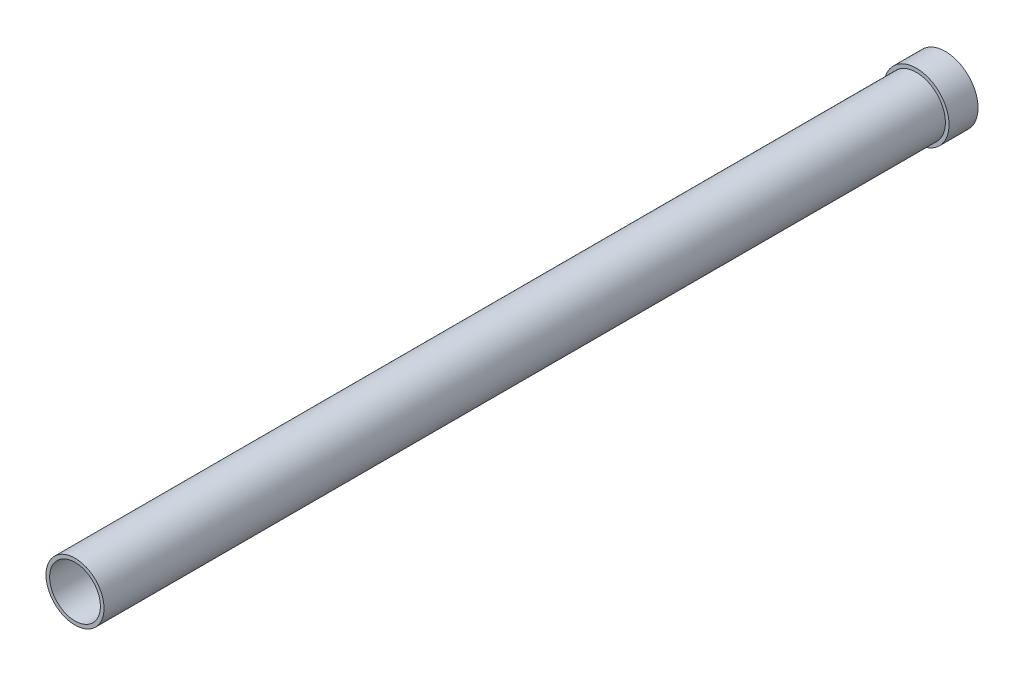
ISO-10303-21;
HEADER;
FILE_DESCRIPTION(('STEP AP214'),'2;1');
FILE_NAME('part.step','',(''),(''),'','','');
FILE_SCHEMA(('AUTOMOTIVE_DESIGN { 1 0 10303 214 1 1 1 1 }'));
ENDSEC;
DATA;
#1=APPLICATION_CONTEXT('core data for automotive mechanical design processes');
#2=APPLICATION_PROTOCOL_DEFINITION('international standard','automotive_design',2000,#1);
#3=PRODUCT_CONTEXT('',#1,'mechanical');
#4=PRODUCT('Part','Part','',(#3));
#5=PRODUCT_RELATED_PRODUCT_CATEGORY('part','',(#4));
#6=PRODUCT_DEFINITION_FORMATION('','',#4);
#7=PRODUCT_DEFINITION_CONTEXT('part definition',#1,'design');
#8=PRODUCT_DEFINITION('design','',#6,#7);
#9=PRODUCT_DEFINITION_SHAPE('','',#8);
#10=(LENGTH_UNIT() NAMED_UNIT(*) SI_UNIT(.MILLI.,.METRE.));
#11=(NAMED_UNIT(*) PLANE_ANGLE_UNIT() SI_UNIT($,.RADIAN.));
#12=(NAMED_UNIT(*) SI_UNIT($,.STERADIAN.) SOLID_ANGLE_UNIT());
#13=UNCERTAINTY_MEASURE_WITH_UNIT(LENGTH_MEASURE(1.E-05),#10,'distance_accuracy_value','');
#14=(GEOMETRIC_REPRESENTATION_CONTEXT(3) GLOBAL_UNCERTAINTY_ASSIGNED_CONTEXT((#13)) GLOBAL_UNIT_ASSIGNED_CONTEXT((#10,
#11,#12)) REPRESENTATION_CONTEXT('',''));
#15=CARTESIAN_POINT('',(0.,0.,0.));
#16=DIRECTION('',(0.,0.,1.));
#17=DIRECTION('',(1.,0.,0.));
#18=AXIS2_PLACEMENT_3D('',#15,#16,#17);
#19=CARTESIAN_POINT('',(0.,0.,76.2));
#20=DIRECTION('',(0.,0.,-1.));
#21=DIRECTION('',(-1.,0.,0.));
#22=AXIS2_PLACEMENT_3D('',#19,#20,#21);
#23=CYLINDRICAL_SURFACE('',#22,2.54);
#24=CARTESIAN_POINT('',(0.,0.,76.2));
#25=DIRECTION('',(0.,0.,1.));
#26=DIRECTION('',(1.,0.,0.));
#27=AXIS2_PLACEMENT_3D('',#24,#25,#26);
#28=CIRCLE('',#27,2.54);
#29=CARTESIAN_POINT('',(-2.54,0.,76.2));
#30=VERTEX_POINT('',#29);
#31=EDGE_CURVE('E39',#30,#30,#28,.T.);
#32=CARTESIAN_POINT('',(0.,0.,2.54));
#33=DIRECTION('',(0.,0.,-1.));
#34=DIRECTION('',(-1.,0.,0.));
#35=AXIS2_PLACEMENT_3D('',#32,#33,#34);
#36=CIRCLE('',#35,2.54);
#37=CARTESIAN_POINT('',(-2.54,0.,2.54000000000001));
#38=VERTEX_POINT('',#37);
#39=EDGE_CURVE('E10',#38,#38,#36,.T.);
#40=CARTESIAN_POINT('',(-2.54,0.,76.2));
#41=CARTESIAN_POINT('',(-2.54,0.,75.4327083333333));
#42=CARTESIAN_POINT('',(-2.54,0.,74.6654166666667));
#43=CARTESIAN_POINT('',(-2.54,0.,73.1308333333333));
#44=CARTESIAN_POINT('',(-2.54,0.,72.3635416666667));
#45=CARTESIAN_POINT('',(-2.54,0.,70.8289583333333));
#46=CARTESIAN_POINT('',(-2.54,0.,70.0616666666667));
#47=CARTESIAN_POINT('',(-2.54,0.,68.5270833333333));
#48=CARTESIAN_POINT('',(-2.54,0.,67.7597916666667));
#49=CARTESIAN_POINT('',(-2.54,0.,66.2252083333333));
#50=CARTESIAN_POINT('',(-2.54,0.,65.4579166666667));
#51=CARTESIAN_POINT('',(-2.54,0.,63.9233333333333));
#52=CARTESIAN_POINT('',(-2.54,0.,63.1560416666667));
#53=CARTESIAN_POINT('',(-2.54,0.,61.6214583333333));
#54=CARTESIAN_POINT('',(-2.54,0.,60.8541666666667));
#55=CARTESIAN_POINT('',(-2.54,0.,59.3195833333333));
#56=CARTESIAN_POINT('',(-2.54,0.,58.5522916666667));
#57=CARTESIAN_POINT('',(-2.54,0.,57.0177083333333));
#58=CARTESIAN_POINT('',(-2.54,0.,56.2504166666667));
#59=CARTESIAN_POINT('',(-2.54,0.,54.7158333333333));
#60=CARTESIAN_POINT('',(-2.54,0.,53.9485416666667));
#61=CARTESIAN_POINT('',(-2.54,0.,52.4139583333333));
#62=CARTESIAN_POINT('',(-2.54,0.,51.6466666666667));
#63=CARTESIAN_POINT('',(-2.54,0.,50.1120833333333));
#64=CARTESIAN_POINT('',(-2.54,0.,49.3447916666667));
#65=CARTESIAN_POINT('',(-2.54,0.,47.8102083333333));
#66=CARTESIAN_POINT('',(-2.54,0.,47.0429166666667));
#67=CARTESIAN_POINT('',(-2.54,0.,45.5083333333333));
#68=CARTESIAN_POINT('',(-2.54,0.,44.7410416666667));
#69=CARTESIAN_POINT('',(-2.54,0.,43.2064583333333));
#70=CARTESIAN_POINT('',(-2.54,0.,42.4391666666667));
#71=CARTESIAN_POINT('',(-2.54,0.,40.9045833333333));
#72=CARTESIAN_POINT('',(-2.54,0.,40.1372916666667));
#73=CARTESIAN_POINT('',(-2.54,0.,38.6027083333333));
#74=CARTESIAN_POINT('',(-2.54,0.,37.8354166666667));
#75=CARTESIAN_POINT('',(-2.54,0.,36.3008333333333));
#76=CARTESIAN_POINT('',(-2.54,0.,35.5335416666667));
#77=CARTESIAN_POINT('',(-2.54,0.,33.9989583333333));
#78=CARTESIAN_POINT('',(-2.54,0.,33.2316666666667));
#79=CARTESIAN_POINT('',(-2.54,0.,31.6970833333333));
#80=CARTESIAN_POINT('',(-2.54,0.,30.9297916666667));
#81=CARTESIAN_POINT('',(-2.54,0.,29.3952083333333));
#82=CARTESIAN_POINT('',(-2.54,0.,28.6279166666667));
#83=CARTESIAN_POINT('',(-2.54,0.,27.0933333333333));
#84=CARTESIAN_POINT('',(-2.54,0.,26.3260416666667));
#85=CARTESIAN_POINT('',(-2.54,0.,24.7914583333333));
#86=CARTESIAN_POINT('',(-2.54,0.,24.0241666666667));
#87=CARTESIAN_POINT('',(-2.54,0.,22.4895833333333));
#88=CARTESIAN_POINT('',(-2.54,0.,21.7222916666667));
#89=CARTESIAN_POINT('',(-2.54,0.,20.1877083333334));
#90=CARTESIAN_POINT('',(-2.54,0.,19.4204166666667));
#91=CARTESIAN_POINT('',(-2.54,0.,17.8858333333333));
#92=CARTESIAN_POINT('',(-2.54,0.,17.1185416666667));
#93=CARTESIAN_POINT('',(-2.54,0.,15.5839583333333));
#94=CARTESIAN_POINT('',(-2.54,0.,14.8166666666667));
#95=CARTESIAN_POINT('',(-2.54,0.,13.2820833333333));
#96=CARTESIAN_POINT('',(-2.54,0.,12.5147916666667));
#97=CARTESIAN_POINT('',(-2.54,0.,10.9802083333333));
#98=CARTESIAN_POINT('',(-2.54,0.,10.2129166666667));
#99=CARTESIAN_POINT('',(-2.54,0.,8.67833333333335));
#100=CARTESIAN_POINT('',(-2.54,0.,7.91104166666668));
#101=CARTESIAN_POINT('',(-2.54,0.,6.37645833333335));
#102=CARTESIAN_POINT('',(-2.54,0.,5.60916666666668));
#103=CARTESIAN_POINT('',(-2.54,0.,4.07458333333334));
#104=CARTESIAN_POINT('',(-2.54,0.,3.30729166666668));
#105=CARTESIAN_POINT('',(-2.54,0.,2.54000000000001));
#106=B_SPLINE_CURVE_WITH_KNOTS('',3,(#40,#41,#42,#43,#44,#45,#46,#47,#48,#49,#50,#51,#52,#53,
#54,#55,#56,#57,#58,#59,#60,#61,#62,#63,#64,#65,#66,#67,#68,#69,#70,#71,#72,#73,#74,#75,#76,#77,
#78,#79,#80,#81,#82,#83,#84,#85,#86,#87,#88,#89,#90,#91,#92,#93,#94,#95,#96,#97,#98,#99,#100,
#101,#102,#103,#104,#105),.UNSPECIFIED.,.F.,.F.,(4,2,2,2,2,2,2,2,2,2,2,2,2,2,2,2,2,2,2,2,2,2,2,
2,2,2,2,2,2,2,2,2,4),(0.,2.301875,4.60374999999999,6.90562499999998,9.20749999999999,11.509375,
13.81125,16.113125,18.415,20.716875,23.01875,25.320625,27.6225,29.924375,32.22625,34.528125,
36.83,39.131875,41.43375,43.735625,46.0375,48.339375,50.64125,52.943125,55.245,57.546875,
59.84875,62.150625,64.4525,66.754375,69.05625,71.358125,73.66),.UNSPECIFIED.);
#107=EDGE_CURVE('BSEAM33',#30,#38,#106,.T.);
#108=ORIENTED_EDGE('',*,*,#31,.F.);
#109=ORIENTED_EDGE('',*,*,#39,.F.);
#110=ORIENTED_EDGE('',*,*,#107,.T.);
#111=ORIENTED_EDGE('',*,*,#107,.F.);
#112=EDGE_LOOP('',(#108,#110,#109,#111));
#113=FACE_BOUND('',#112,.T.);
#114=ADVANCED_FACE('F33',(#113),#23,.T.);
#115=CARTESIAN_POINT('',(0.,0.,76.2));
#116=DIRECTION('',(0.,0.,1.));
#117=DIRECTION('',(1.,0.,0.));
#118=AXIS2_PLACEMENT_3D('',#115,#116,#117);
#119=PLANE('',#118);
#120=ORIENTED_EDGE('',*,*,#31,.T.);
#121=EDGE_LOOP('',(#120));
#122=FACE_BOUND('',#121,.T.);
#123=CARTESIAN_POINT('',(0.,0.,76.2));
#124=DIRECTION('',(0.,0.,1.));
#125=DIRECTION('',(1.,0.,0.));
#126=AXIS2_PLACEMENT_3D('',#123,#124,#125);
#127=CIRCLE('',#126,2.2225);
#128=CARTESIAN_POINT('',(-2.2225,0.,76.2));
#129=VERTEX_POINT('',#128);
#130=EDGE_CURVE('E43',#129,#129,#127,.T.);
#131=ORIENTED_EDGE('',*,*,#130,.F.);
#132=EDGE_LOOP('',(#131));
#133=FACE_BOUND('',#132,.T.);
#134=ADVANCED_FACE('F71',(#122,#133),#119,.T.);
#135=CARTESIAN_POINT('',(0.,0.,0.));
#136=DIRECTION('',(0.,0.,1.));
#137=DIRECTION('',(1.,0.,0.));
#138=AXIS2_PLACEMENT_3D('',#135,#136,#137);
#139=PLANE('',#138);
#140=CARTESIAN_POINT('',(0.,0.,0.));
#141=DIRECTION('',(0.,0.,1.));
#142=DIRECTION('',(1.,0.,0.));
#143=AXIS2_PLACEMENT_3D('',#140,#141,#142);
#144=CIRCLE('',#143,2.2225);
#145=CARTESIAN_POINT('',(-2.2225,0.,0.));
#146=VERTEX_POINT('',#145);
#147=EDGE_CURVE('E47',#146,#146,#144,.T.);
#148=ORIENTED_EDGE('',*,*,#147,.T.);
#149=EDGE_LOOP('',(#148));
#150=FACE_BOUND('',#149,.T.);
#151=CARTESIAN_POINT('',(0.,0.,0.));
#152=DIRECTION('',(0.,0.,-1.));
#153=DIRECTION('',(-1.,0.,0.));
#154=AXIS2_PLACEMENT_3D('',#151,#152,#153);
#155=CIRCLE('',#154,2.8575);
#156=CARTESIAN_POINT('',(-2.8575,0.,0.));
#157=VERTEX_POINT('',#156);
#158=EDGE_CURVE('E53',#157,#157,#155,.T.);
#159=ORIENTED_EDGE('',*,*,#158,.T.);
#160=EDGE_LOOP('',(#159));
#161=FACE_BOUND('',#160,.T.);
#162=ADVANCED_FACE('F76',(#150,#161),#139,.F.);
#163=CARTESIAN_POINT('',(0.,0.,76.2));
#164=DIRECTION('',(0.,0.,-1.));
#165=DIRECTION('',(-1.,0.,0.));
#166=AXIS2_PLACEMENT_3D('',#163,#164,#165);
#167=CYLINDRICAL_SURFACE('',#166,2.2225);
#168=CARTESIAN_POINT('',(-2.2225,0.,76.2));
#169=CARTESIAN_POINT('',(-2.2225,0.,75.40625));
#170=CARTESIAN_POINT('',(-2.2225,0.,74.6125));
#171=CARTESIAN_POINT('',(-2.2225,0.,73.025));
#172=CARTESIAN_POINT('',(-2.2225,0.,72.23125));
#173=CARTESIAN_POINT('',(-2.2225,0.,70.64375));
#174=CARTESIAN_POINT('',(-2.2225,0.,69.85));
#175=CARTESIAN_POINT('',(-2.2225,0.,68.2625));
#176=CARTESIAN_POINT('',(-2.2225,0.,67.46875));
#177=CARTESIAN_POINT('',(-2.2225,0.,65.88125));
#178=CARTESIAN_POINT('',(-2.2225,0.,65.0875));
#179=CARTESIAN_POINT('',(-2.2225,0.,63.5));
#180=CARTESIAN_POINT('',(-2.2225,0.,62.70625));
#181=CARTESIAN_POINT('',(-2.2225,0.,61.11875));
#182=CARTESIAN_POINT('',(-2.2225,0.,60.325));
#183=CARTESIAN_POINT('',(-2.2225,0.,58.7375));
#184=CARTESIAN_POINT('',(-2.2225,0.,57.94375));
#185=CARTESIAN_POINT('',(-2.2225,0.,56.35625));
#186=CARTESIAN_POINT('',(-2.2225,0.,55.5625));
#187=CARTESIAN_POINT('',(-2.2225,0.,53.975));
#188=CARTESIAN_POINT('',(-2.2225,0.,53.18125));
#189=CARTESIAN_POINT('',(-2.2225,0.,51.59375));
#190=CARTESIAN_POINT('',(-2.2225,0.,50.8));
#191=CARTESIAN_POINT('',(-2.2225,0.,49.2125));
#192=CARTESIAN_POINT('',(-2.2225,0.,48.41875));
#193=CARTESIAN_POINT('',(-2.2225,0.,46.83125));
#194=CARTESIAN_POINT('',(-2.2225,0.,46.0375));
#195=CARTESIAN_POINT('',(-2.2225,0.,44.45));
#196=CARTESIAN_POINT('',(-2.2225,0.,43.65625));
#197=CARTESIAN_POINT('',(-2.2225,0.,42.06875));
#198=CARTESIAN_POINT('',(-2.2225,0.,41.275));
#199=CARTESIAN_POINT('',(-2.2225,0.,39.6875));
#200=CARTESIAN_POINT('',(-2.2225,0.,38.89375));
#201=CARTESIAN_POINT('',(-2.2225,0.,37.30625));
#202=CARTESIAN_POINT('',(-2.2225,0.,36.5125));
#203=CARTESIAN_POINT('',(-2.2225,0.,34.925));
#204=CARTESIAN_POINT('',(-2.2225,0.,34.13125));
#205=CARTESIAN_POINT('',(-2.2225,0.,32.54375));
#206=CARTESIAN_POINT('',(-2.2225,0.,31.75));
#207=CARTESIAN_POINT('',(-2.2225,0.,30.1625));
#208=CARTESIAN_POINT('',(-2.2225,0.,29.36875));
#209=CARTESIAN_POINT('',(-2.2225,0.,27.78125));
#210=CARTESIAN_POINT('',(-2.2225,0.,26.9875));
#211=CARTESIAN_POINT('',(-2.2225,0.,25.4));
#212=CARTESIAN_POINT('',(-2.2225,0.,24.60625));
#213=CARTESIAN_POINT('',(-2.2225,0.,23.01875));
#214=CARTESIAN_POINT('',(-2.2225,0.,22.225));
#215=CARTESIAN_POINT('',(-2.2225,0.,20.6375));
#216=CARTESIAN_POINT('',(-2.2225,0.,19.84375));
#217=CARTESIAN_POINT('',(-2.2225,0.,18.25625));
#218=CARTESIAN_POINT('',(-2.2225,0.,17.4625));
#219=CARTESIAN_POINT('',(-2.2225,0.,15.875));
#220=CARTESIAN_POINT('',(-2.2225,0.,15.08125));
#221=CARTESIAN_POINT('',(-2.2225,0.,13.49375));
#222=CARTESIAN_POINT('',(-2.2225,0.,12.7));
#223=CARTESIAN_POINT('',(-2.2225,0.,11.1125));
#224=CARTESIAN_POINT('',(-2.2225,0.,10.31875));
#225=CARTESIAN_POINT('',(-2.2225,0.,8.73125));
#226=CARTESIAN_POINT('',(-2.2225,0.,7.93750000000001));
#227=CARTESIAN_POINT('',(-2.2225,0.,6.35));
#228=CARTESIAN_POINT('',(-2.2225,0.,5.55625));
#229=CARTESIAN_POINT('',(-2.2225,0.,3.96875));
#230=CARTESIAN_POINT('',(-2.2225,0.,3.175));
#231=CARTESIAN_POINT('',(-2.2225,0.,1.5875));
#232=CARTESIAN_POINT('',(-2.2225,0.,0.793750000000001));
#233=CARTESIAN_POINT('',(-2.2225,0.,0.));
#234=B_SPLINE_CURVE_WITH_KNOTS('',3,(#168,#169,#170,#171,#172,#173,#174,#175,#176,#177,#178,
#179,#180,#181,#182,#183,#184,#185,#186,#187,#188,#189,#190,#191,#192,#193,#194,#195,#196,#197,
#198,#199,#200,#201,#202,#203,#204,#205,#206,#207,#208,#209,#210,#211,#212,#213,#214,#215,#216,
#217,#218,#219,#220,#221,#222,#223,#224,#225,#226,#227,#228,#229,#230,#231,#232,#233),
.UNSPECIFIED.,.F.,.F.,(4,2,2,2,2,2,2,2,2,2,2,2,2,2,2,2,2,2,2,2,2,2,2,2,2,2,2,2,2,2,2,2,4),(0.,
2.38124999999999,4.76249999999999,7.14374999999999,9.52499999999999,11.90625,14.2875,16.66875,
19.05,21.43125,23.8125,26.19375,28.575,30.95625,33.3375,35.71875,38.1,40.48125,42.8625,45.24375,
47.625,50.00625,52.3875,54.76875,57.15,59.53125,61.9125,64.29375,66.675,69.05625,71.4375,
73.81875,76.2),.UNSPECIFIED.);
#235=EDGE_CURVE('BSEAM68',#129,#146,#234,.T.);
#236=ORIENTED_EDGE('',*,*,#130,.T.);
#237=ORIENTED_EDGE('',*,*,#147,.F.);
#238=ORIENTED_EDGE('',*,*,#235,.T.);
#239=ORIENTED_EDGE('',*,*,#235,.F.);
#240=EDGE_LOOP('',(#236,#238,#237,#239));
#241=FACE_BOUND('',#240,.T.);
#242=ADVANCED_FACE('F68',(#241),#167,.F.);
#243=CARTESIAN_POINT('',(0.,0.,2.54));
#244=DIRECTION('',(0.,0.,-1.));
#245=DIRECTION('',(-1.,0.,0.));
#246=AXIS2_PLACEMENT_3D('',#243,#244,#245);
#247=CYLINDRICAL_SURFACE('',#246,2.8575);
#248=CARTESIAN_POINT('',(0.,0.,2.54));
#249=DIRECTION('',(0.,0.,-1.));
#250=DIRECTION('',(-1.,0.,0.));
#251=AXIS2_PLACEMENT_3D('',#248,#249,#250);
#252=CIRCLE('',#251,2.8575);
#253=CARTESIAN_POINT('',(-2.8575,0.,2.54));
#254=VERTEX_POINT('',#253);
#255=EDGE_CURVE('E51',#254,#254,#252,.T.);
#256=ORIENTED_EDGE('',*,*,#255,.T.);
#257=EDGE_LOOP('',(#256));
#258=FACE_BOUND('',#257,.T.);
#259=ORIENTED_EDGE('',*,*,#158,.F.);
#260=EDGE_LOOP('',(#259));
#261=FACE_BOUND('',#260,.T.);
#262=ADVANCED_FACE('F59',(#258,#261),#247,.T.);
#263=CARTESIAN_POINT('',(0.,0.,2.54));
#264=DIRECTION('',(0.,0.,-1.));
#265=DIRECTION('',(-1.,0.,0.));
#266=AXIS2_PLACEMENT_3D('',#263,#264,#265);
#267=PLANE('',#266);
#268=ORIENTED_EDGE('',*,*,#39,.T.);
#269=EDGE_LOOP('',(#268));
#270=FACE_BOUND('',#269,.T.);
#271=ORIENTED_EDGE('',*,*,#255,.F.);
#272=EDGE_LOOP('',(#271));
#273=FACE_BOUND('',#272,.T.);
#274=ADVANCED_FACE('F62',(#270,#273),#267,.F.);
#275=CLOSED_SHELL('',(#114,#134,#162,#242,#262,#274));
#276=MANIFOLD_SOLID_BREP('B2',#275);
#277=ADVANCED_BREP_SHAPE_REPRESENTATION('',(#18,#276),#14);
#278=SHAPE_DEFINITION_REPRESENTATION(#9,#277);
ENDSEC;
END-ISO-10303-21;
